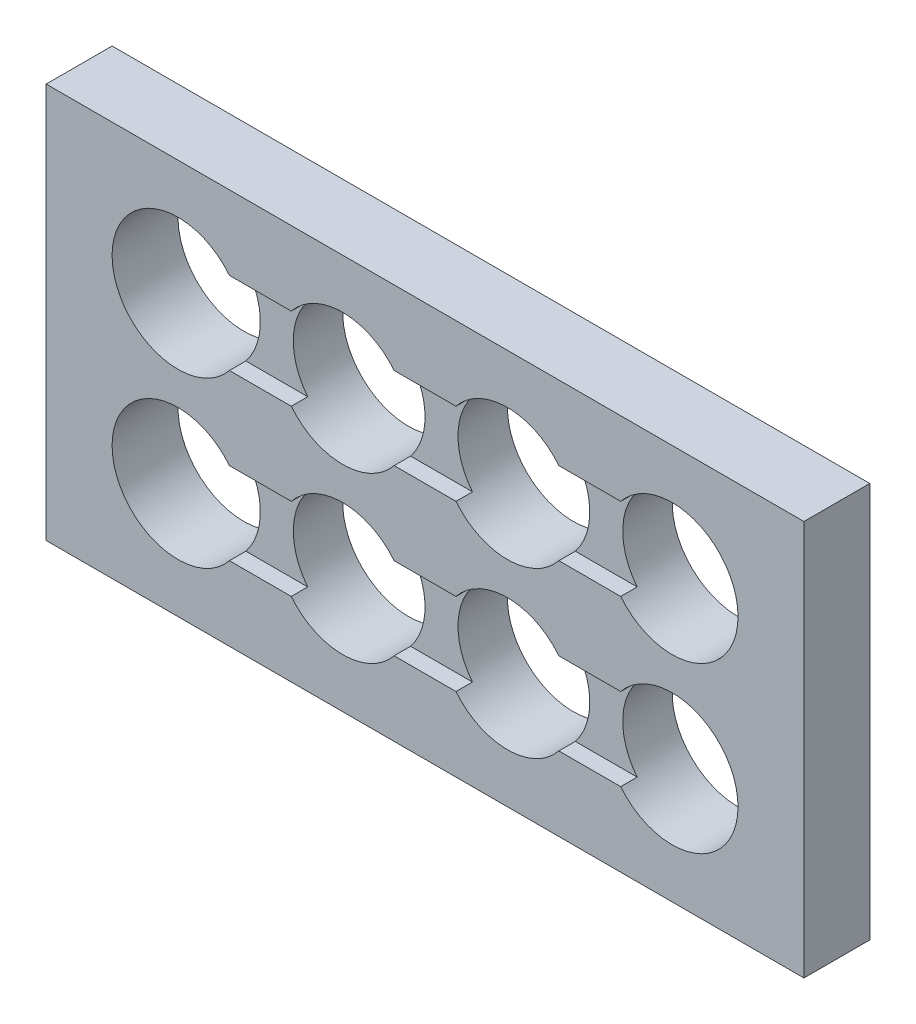
ISO-10303-21;
HEADER;
FILE_DESCRIPTION(('STEP AP214'),'2;1');
FILE_NAME('part.step','',(''),(''),'','','');
FILE_SCHEMA(('AUTOMOTIVE_DESIGN { 1 0 10303 214 1 1 1 1 }'));
ENDSEC;
DATA;
#1=APPLICATION_CONTEXT('core data for automotive mechanical design processes');
#2=APPLICATION_PROTOCOL_DEFINITION('international standard','automotive_design',2000,#1);
#3=PRODUCT_CONTEXT('',#1,'mechanical');
#4=PRODUCT('Part','Part','',(#3));
#5=PRODUCT_RELATED_PRODUCT_CATEGORY('part','',(#4));
#6=PRODUCT_DEFINITION_FORMATION('','',#4);
#7=PRODUCT_DEFINITION_CONTEXT('part definition',#1,'design');
#8=PRODUCT_DEFINITION('design','',#6,#7);
#9=PRODUCT_DEFINITION_SHAPE('','',#8);
#10=(LENGTH_UNIT() NAMED_UNIT(*) SI_UNIT(.MILLI.,.METRE.));
#11=(NAMED_UNIT(*) PLANE_ANGLE_UNIT() SI_UNIT($,.RADIAN.));
#12=(NAMED_UNIT(*) SI_UNIT($,.STERADIAN.) SOLID_ANGLE_UNIT());
#13=UNCERTAINTY_MEASURE_WITH_UNIT(LENGTH_MEASURE(1.E-05),#10,'distance_accuracy_value','');
#14=(GEOMETRIC_REPRESENTATION_CONTEXT(3) GLOBAL_UNCERTAINTY_ASSIGNED_CONTEXT((#13)) GLOBAL_UNIT_ASSIGNED_CONTEXT((#10,
#11,#12)) REPRESENTATION_CONTEXT('',''));
#15=CARTESIAN_POINT('',(0.,0.,0.));
#16=DIRECTION('',(0.,0.,1.));
#17=DIRECTION('',(1.,0.,0.));
#18=AXIS2_PLACEMENT_3D('',#15,#16,#17);
#19=CARTESIAN_POINT('',(0.,0.,4.));
#20=DIRECTION('',(0.,0.,1.));
#21=DIRECTION('',(1.,0.,0.));
#22=AXIS2_PLACEMENT_3D('',#19,#20,#21);
#23=PLANE('',#22);
#24=DIRECTION('',(1.,0.,0.));
#25=VECTOR('',#24,1.);
#26=CARTESIAN_POINT('',(15.,2.5,4.));
#27=LINE('',#26,#25);
#28=CARTESIAN_POINT('',(-11.8775010008008,2.5,4.));
#29=VERTEX_POINT('',#28);
#30=CARTESIAN_POINT('',(-8.1224989991992,2.5,4.));
#31=VERTEX_POINT('',#30);
#32=EDGE_CURVE('E232',#29,#31,#27,.T.);
#33=ORIENTED_EDGE('',*,*,#32,.F.);
#34=CARTESIAN_POINT('',(-15.,5.,4.));
#35=DIRECTION('',(0.,0.,1.));
#36=DIRECTION('',(1.,0.,0.));
#37=AXIS2_PLACEMENT_3D('',#34,#35,#36);
#38=CIRCLE('',#37,4.);
#39=CARTESIAN_POINT('',(-11.8775010008008,7.5,4.));
#40=VERTEX_POINT('',#39);
#41=EDGE_CURVE('E248',#40,#29,#38,.T.);
#42=ORIENTED_EDGE('',*,*,#41,.F.);
#43=DIRECTION('',(-1.,0.,0.));
#44=VECTOR('',#43,1.);
#45=CARTESIAN_POINT('',(15.,7.5,4.));
#46=LINE('',#45,#44);
#47=CARTESIAN_POINT('',(-8.1224989991992,7.5,4.));
#48=VERTEX_POINT('',#47);
#49=EDGE_CURVE('E253',#48,#40,#46,.T.);
#50=ORIENTED_EDGE('',*,*,#49,.F.);
#51=CARTESIAN_POINT('',(-5.,5.,4.));
#52=DIRECTION('',(0.,0.,1.));
#53=DIRECTION('',(1.,0.,0.));
#54=AXIS2_PLACEMENT_3D('',#51,#52,#53);
#55=CIRCLE('',#54,4.);
#56=CARTESIAN_POINT('',(-1.8775010008008,7.5,4.));
#57=VERTEX_POINT('',#56);
#58=EDGE_CURVE('E289',#57,#48,#55,.T.);
#59=ORIENTED_EDGE('',*,*,#58,.F.);
#60=CARTESIAN_POINT('',(1.8775010008008,7.5,4.));
#61=VERTEX_POINT('',#60);
#62=EDGE_CURVE('E431',#61,#57,#46,.T.);
#63=ORIENTED_EDGE('',*,*,#62,.F.);
#64=CARTESIAN_POINT('',(5.,5.,4.));
#65=DIRECTION('',(0.,0.,1.));
#66=DIRECTION('',(1.,0.,0.));
#67=AXIS2_PLACEMENT_3D('',#64,#65,#66);
#68=CIRCLE('',#67,4.);
#69=CARTESIAN_POINT('',(8.1224989991992,7.5,4.));
#70=VERTEX_POINT('',#69);
#71=EDGE_CURVE('E280',#70,#61,#68,.T.);
#72=ORIENTED_EDGE('',*,*,#71,.F.);
#73=CARTESIAN_POINT('',(11.8775010008008,7.5,4.));
#74=VERTEX_POINT('',#73);
#75=EDGE_CURVE('E432',#74,#70,#46,.T.);
#76=ORIENTED_EDGE('',*,*,#75,.F.);
#77=CARTESIAN_POINT('',(15.,5.,4.));
#78=DIRECTION('',(0.,0.,1.));
#79=DIRECTION('',(1.,0.,0.));
#80=AXIS2_PLACEMENT_3D('',#77,#78,#79);
#81=CIRCLE('',#80,4.);
#82=CARTESIAN_POINT('',(11.8775010008008,2.5,4.));
#83=VERTEX_POINT('',#82);
#84=EDGE_CURVE('E268',#83,#74,#81,.T.);
#85=ORIENTED_EDGE('',*,*,#84,.F.);
#86=CARTESIAN_POINT('',(8.1224989991992,2.5,4.));
#87=VERTEX_POINT('',#86);
#88=EDGE_CURVE('E256',#87,#83,#27,.T.);
#89=ORIENTED_EDGE('',*,*,#88,.F.);
#90=CARTESIAN_POINT('',(1.8775010008008,2.5,4.));
#91=VERTEX_POINT('',#90);
#92=EDGE_CURVE('E285',#91,#87,#68,.T.);
#93=ORIENTED_EDGE('',*,*,#92,.F.);
#94=CARTESIAN_POINT('',(-1.8775010008008,2.5,4.));
#95=VERTEX_POINT('',#94);
#96=EDGE_CURVE('E254',#95,#91,#27,.T.);
#97=ORIENTED_EDGE('',*,*,#96,.F.);
#98=EDGE_CURVE('E251',#31,#95,#55,.T.);
#99=ORIENTED_EDGE('',*,*,#98,.F.);
#100=EDGE_LOOP('',(#33,#42,#50,#59,#63,#72,#76,#85,#89,#93,#97,#99));
#101=FACE_BOUND('',#100,.T.);
#102=DIRECTION('',(-1.,0.,0.));
#103=VECTOR('',#102,1.);
#104=CARTESIAN_POINT('',(15.,-2.5,4.));
#105=LINE('',#104,#103);
#106=CARTESIAN_POINT('',(11.8775010008008,-2.5,4.));
#107=VERTEX_POINT('',#106);
#108=CARTESIAN_POINT('',(8.1224989991992,-2.5,4.));
#109=VERTEX_POINT('',#108);
#110=EDGE_CURVE('E428',#107,#109,#105,.T.);
#111=ORIENTED_EDGE('',*,*,#110,.F.);
#112=CARTESIAN_POINT('',(15.,-5.,4.));
#113=DIRECTION('',(0.,0.,1.));
#114=DIRECTION('',(1.,0.,0.));
#115=AXIS2_PLACEMENT_3D('',#112,#113,#114);
#116=CIRCLE('',#115,4.);
#117=CARTESIAN_POINT('',(11.8775010008008,-7.5,4.));
#118=VERTEX_POINT('',#117);
#119=EDGE_CURVE('E297',#118,#107,#116,.T.);
#120=ORIENTED_EDGE('',*,*,#119,.F.);
#121=DIRECTION('',(1.,0.,0.));
#122=VECTOR('',#121,1.);
#123=CARTESIAN_POINT('',(15.,-7.5,4.));
#124=LINE('',#123,#122);
#125=CARTESIAN_POINT('',(8.1224989991992,-7.5,4.));
#126=VERTEX_POINT('',#125);
#127=EDGE_CURVE('E388',#126,#118,#124,.T.);
#128=ORIENTED_EDGE('',*,*,#127,.F.);
#129=CARTESIAN_POINT('',(5.,-5.,4.));
#130=DIRECTION('',(0.,0.,1.));
#131=DIRECTION('',(1.,0.,0.));
#132=AXIS2_PLACEMENT_3D('',#129,#130,#131);
#133=CIRCLE('',#132,4.);
#134=CARTESIAN_POINT('',(1.8775010008008,-7.5,4.));
#135=VERTEX_POINT('',#134);
#136=EDGE_CURVE('E310',#135,#126,#133,.T.);
#137=ORIENTED_EDGE('',*,*,#136,.F.);
#138=CARTESIAN_POINT('',(-1.8775010008008,-7.5,4.));
#139=VERTEX_POINT('',#138);
#140=EDGE_CURVE('E411',#139,#135,#124,.T.);
#141=ORIENTED_EDGE('',*,*,#140,.F.);
#142=CARTESIAN_POINT('',(-5.,-5.,4.));
#143=DIRECTION('',(0.,0.,1.));
#144=DIRECTION('',(1.,0.,0.));
#145=AXIS2_PLACEMENT_3D('',#142,#143,#144);
#146=CIRCLE('',#145,4.);
#147=CARTESIAN_POINT('',(-8.12249899919919,-7.5,4.));
#148=VERTEX_POINT('',#147);
#149=EDGE_CURVE('E319',#148,#139,#146,.T.);
#150=ORIENTED_EDGE('',*,*,#149,.F.);
#151=CARTESIAN_POINT('',(-11.8775010008008,-7.5,4.));
#152=VERTEX_POINT('',#151);
#153=EDGE_CURVE('E413',#152,#148,#124,.T.);
#154=ORIENTED_EDGE('',*,*,#153,.F.);
#155=CARTESIAN_POINT('',(-15.,-5.,4.));
#156=DIRECTION('',(0.,0.,1.));
#157=DIRECTION('',(1.,0.,0.));
#158=AXIS2_PLACEMENT_3D('',#155,#156,#157);
#159=CIRCLE('',#158,4.);
#160=CARTESIAN_POINT('',(-11.8775010008008,-2.5,4.));
#161=VERTEX_POINT('',#160);
#162=EDGE_CURVE('E323',#161,#152,#159,.T.);
#163=ORIENTED_EDGE('',*,*,#162,.F.);
#164=CARTESIAN_POINT('',(-8.1224989991992,-2.5,4.));
#165=VERTEX_POINT('',#164);
#166=EDGE_CURVE('E425',#165,#161,#105,.T.);
#167=ORIENTED_EDGE('',*,*,#166,.F.);
#168=CARTESIAN_POINT('',(-1.8775010008008,-2.5,4.));
#169=VERTEX_POINT('',#168);
#170=EDGE_CURVE('E314',#169,#165,#146,.T.);
#171=ORIENTED_EDGE('',*,*,#170,.F.);
#172=CARTESIAN_POINT('',(1.8775010008008,-2.5,4.));
#173=VERTEX_POINT('',#172);
#174=EDGE_CURVE('E427',#173,#169,#105,.T.);
#175=ORIENTED_EDGE('',*,*,#174,.F.);
#176=EDGE_CURVE('E305',#109,#173,#133,.T.);
#177=ORIENTED_EDGE('',*,*,#176,.F.);
#178=EDGE_LOOP('',(#111,#120,#128,#137,#141,#150,#154,#163,#167,#171,#175,#177));
#179=FACE_BOUND('',#178,.T.);
#180=DIRECTION('',(0.,-1.,0.));
#181=VECTOR('',#180,1.);
#182=CARTESIAN_POINT('',(-23.,12.,4.));
#183=LINE('',#182,#181);
#184=CARTESIAN_POINT('',(-23.,12.,4.));
#185=VERTEX_POINT('',#184);
#186=CARTESIAN_POINT('',(-23.,-12.,4.));
#187=VERTEX_POINT('',#186);
#188=EDGE_CURVE('E331',#185,#187,#183,.T.);
#189=ORIENTED_EDGE('',*,*,#188,.T.);
#190=DIRECTION('',(1.,0.,0.));
#191=VECTOR('',#190,1.);
#192=CARTESIAN_POINT('',(-23.,-12.,4.));
#193=LINE('',#192,#191);
#194=CARTESIAN_POINT('',(23.,-12.,4.));
#195=VERTEX_POINT('',#194);
#196=EDGE_CURVE('E335',#187,#195,#193,.T.);
#197=ORIENTED_EDGE('',*,*,#196,.T.);
#198=DIRECTION('',(0.,1.,0.));
#199=VECTOR('',#198,1.);
#200=CARTESIAN_POINT('',(23.,12.,4.));
#201=LINE('',#200,#199);
#202=CARTESIAN_POINT('',(23.,12.,4.));
#203=VERTEX_POINT('',#202);
#204=EDGE_CURVE('E339',#195,#203,#201,.T.);
#205=ORIENTED_EDGE('',*,*,#204,.T.);
#206=DIRECTION('',(-1.,0.,0.));
#207=VECTOR('',#206,1.);
#208=CARTESIAN_POINT('',(-23.,12.,4.));
#209=LINE('',#208,#207);
#210=EDGE_CURVE('E342',#203,#185,#209,.T.);
#211=ORIENTED_EDGE('',*,*,#210,.T.);
#212=EDGE_LOOP('',(#189,#197,#205,#211));
#213=FACE_BOUND('',#212,.T.);
#214=ADVANCED_FACE('F44',(#101,#179,#213),#23,.T.);
#215=CARTESIAN_POINT('',(0.,0.,0.));
#216=DIRECTION('',(0.,0.,1.));
#217=DIRECTION('',(1.,0.,0.));
#218=AXIS2_PLACEMENT_3D('',#215,#216,#217);
#219=PLANE('',#218);
#220=DIRECTION('',(0.,-1.,0.));
#221=VECTOR('',#220,1.);
#222=CARTESIAN_POINT('',(-23.,12.,0.));
#223=LINE('',#222,#221);
#224=CARTESIAN_POINT('',(-23.,12.,0.));
#225=VERTEX_POINT('',#224);
#226=CARTESIAN_POINT('',(-23.,-12.,0.));
#227=VERTEX_POINT('',#226);
#228=EDGE_CURVE('E327',#225,#227,#223,.T.);
#229=ORIENTED_EDGE('',*,*,#228,.F.);
#230=DIRECTION('',(-1.,0.,0.));
#231=VECTOR('',#230,1.);
#232=CARTESIAN_POINT('',(-23.,12.,0.));
#233=LINE('',#232,#231);
#234=CARTESIAN_POINT('',(23.,12.,0.));
#235=VERTEX_POINT('',#234);
#236=EDGE_CURVE('E336',#235,#225,#233,.T.);
#237=ORIENTED_EDGE('',*,*,#236,.F.);
#238=DIRECTION('',(0.,1.,0.));
#239=VECTOR('',#238,1.);
#240=CARTESIAN_POINT('',(23.,12.,0.));
#241=LINE('',#240,#239);
#242=CARTESIAN_POINT('',(23.,-12.,0.));
#243=VERTEX_POINT('',#242);
#244=EDGE_CURVE('E352',#243,#235,#241,.T.);
#245=ORIENTED_EDGE('',*,*,#244,.F.);
#246=DIRECTION('',(1.,0.,0.));
#247=VECTOR('',#246,1.);
#248=CARTESIAN_POINT('',(-23.,-12.,0.));
#249=LINE('',#248,#247);
#250=EDGE_CURVE('E349',#227,#243,#249,.T.);
#251=ORIENTED_EDGE('',*,*,#250,.F.);
#252=EDGE_LOOP('',(#229,#237,#245,#251));
#253=FACE_BOUND('',#252,.T.);
#254=CARTESIAN_POINT('',(-15.,-5.,0.));
#255=DIRECTION('',(0.,0.,1.));
#256=DIRECTION('',(1.,0.,0.));
#257=AXIS2_PLACEMENT_3D('',#254,#255,#256);
#258=CIRCLE('',#257,4.);
#259=CARTESIAN_POINT('',(-11.,-5.,0.));
#260=VERTEX_POINT('',#259);
#261=EDGE_CURVE('E318',#260,#260,#258,.T.);
#262=ORIENTED_EDGE('',*,*,#261,.T.);
#263=EDGE_LOOP('',(#262));
#264=FACE_BOUND('',#263,.T.);
#265=CARTESIAN_POINT('',(-5.,-5.,0.));
#266=DIRECTION('',(0.,0.,1.));
#267=DIRECTION('',(1.,0.,0.));
#268=AXIS2_PLACEMENT_3D('',#265,#266,#267);
#269=CIRCLE('',#268,4.);
#270=CARTESIAN_POINT('',(-0.999999999999997,-5.,0.));
#271=VERTEX_POINT('',#270);
#272=EDGE_CURVE('E309',#271,#271,#269,.T.);
#273=ORIENTED_EDGE('',*,*,#272,.T.);
#274=EDGE_LOOP('',(#273));
#275=FACE_BOUND('',#274,.T.);
#276=CARTESIAN_POINT('',(5.,-5.,0.));
#277=DIRECTION('',(0.,0.,1.));
#278=DIRECTION('',(1.,0.,0.));
#279=AXIS2_PLACEMENT_3D('',#276,#277,#278);
#280=CIRCLE('',#279,4.);
#281=CARTESIAN_POINT('',(9.,-5.,0.));
#282=VERTEX_POINT('',#281);
#283=EDGE_CURVE('E301',#282,#282,#280,.T.);
#284=ORIENTED_EDGE('',*,*,#283,.T.);
#285=EDGE_LOOP('',(#284));
#286=FACE_BOUND('',#285,.T.);
#287=CARTESIAN_POINT('',(15.,-5.,0.));
#288=DIRECTION('',(0.,0.,1.));
#289=DIRECTION('',(1.,0.,0.));
#290=AXIS2_PLACEMENT_3D('',#287,#288,#289);
#291=CIRCLE('',#290,4.);
#292=CARTESIAN_POINT('',(19.,-5.,0.));
#293=VERTEX_POINT('',#292);
#294=EDGE_CURVE('E293',#293,#293,#291,.T.);
#295=ORIENTED_EDGE('',*,*,#294,.T.);
#296=EDGE_LOOP('',(#295));
#297=FACE_BOUND('',#296,.T.);
#298=CARTESIAN_POINT('',(-5.,5.,0.));
#299=DIRECTION('',(0.,0.,1.));
#300=DIRECTION('',(1.,0.,0.));
#301=AXIS2_PLACEMENT_3D('',#298,#299,#300);
#302=CIRCLE('',#301,4.);
#303=CARTESIAN_POINT('',(-0.999999999999997,5.,0.));
#304=VERTEX_POINT('',#303);
#305=EDGE_CURVE('E284',#304,#304,#302,.T.);
#306=ORIENTED_EDGE('',*,*,#305,.T.);
#307=EDGE_LOOP('',(#306));
#308=FACE_BOUND('',#307,.T.);
#309=CARTESIAN_POINT('',(5.,5.,0.));
#310=DIRECTION('',(0.,0.,1.));
#311=DIRECTION('',(1.,0.,0.));
#312=AXIS2_PLACEMENT_3D('',#309,#310,#311);
#313=CIRCLE('',#312,4.);
#314=CARTESIAN_POINT('',(9.,5.,0.));
#315=VERTEX_POINT('',#314);
#316=EDGE_CURVE('E278',#315,#315,#313,.T.);
#317=ORIENTED_EDGE('',*,*,#316,.T.);
#318=EDGE_LOOP('',(#317));
#319=FACE_BOUND('',#318,.T.);
#320=CARTESIAN_POINT('',(15.,5.,0.));
#321=DIRECTION('',(0.,0.,1.));
#322=DIRECTION('',(1.,0.,0.));
#323=AXIS2_PLACEMENT_3D('',#320,#321,#322);
#324=CIRCLE('',#323,4.);
#325=CARTESIAN_POINT('',(19.,5.,0.));
#326=VERTEX_POINT('',#325);
#327=EDGE_CURVE('E262',#326,#326,#324,.T.);
#328=ORIENTED_EDGE('',*,*,#327,.T.);
#329=EDGE_LOOP('',(#328));
#330=FACE_BOUND('',#329,.T.);
#331=CARTESIAN_POINT('',(-15.,5.,0.));
#332=DIRECTION('',(0.,0.,1.));
#333=DIRECTION('',(1.,0.,0.));
#334=AXIS2_PLACEMENT_3D('',#331,#332,#333);
#335=CIRCLE('',#334,4.);
#336=CARTESIAN_POINT('',(-11.,5.,0.));
#337=VERTEX_POINT('',#336);
#338=EDGE_CURVE('E263',#337,#337,#335,.T.);
#339=ORIENTED_EDGE('',*,*,#338,.T.);
#340=EDGE_LOOP('',(#339));
#341=FACE_BOUND('',#340,.T.);
#342=ADVANCED_FACE('F644',(#253,#264,#275,#286,#297,#308,#319,#330,#341),#219,.F.);
#343=CARTESIAN_POINT('',(-23.,12.,4.));
#344=DIRECTION('',(1.,0.,0.));
#345=DIRECTION('',(0.,0.,-1.));
#346=AXIS2_PLACEMENT_3D('',#343,#344,#345);
#347=PLANE('',#346);
#348=ORIENTED_EDGE('',*,*,#228,.T.);
#349=DIRECTION('',(0.,0.,-1.));
#350=VECTOR('',#349,1.);
#351=CARTESIAN_POINT('',(-23.,-12.,4.));
#352=LINE('',#351,#350);
#353=EDGE_CURVE('E368',#187,#227,#352,.T.);
#354=ORIENTED_EDGE('',*,*,#353,.F.);
#355=ORIENTED_EDGE('',*,*,#188,.F.);
#356=DIRECTION('',(0.,0.,-1.));
#357=VECTOR('',#356,1.);
#358=CARTESIAN_POINT('',(-23.,12.,4.));
#359=LINE('',#358,#357);
#360=EDGE_CURVE('E345',#185,#225,#359,.T.);
#361=ORIENTED_EDGE('',*,*,#360,.T.);
#362=EDGE_LOOP('',(#348,#354,#355,#361));
#363=FACE_BOUND('',#362,.T.);
#364=ADVANCED_FACE('F46',(#363),#347,.F.);
#365=CARTESIAN_POINT('',(-23.,-12.,4.));
#366=DIRECTION('',(0.,1.,0.));
#367=DIRECTION('',(0.,0.,1.));
#368=AXIS2_PLACEMENT_3D('',#365,#366,#367);
#369=PLANE('',#368);
#370=ORIENTED_EDGE('',*,*,#250,.T.);
#371=DIRECTION('',(0.,0.,-1.));
#372=VECTOR('',#371,1.);
#373=CARTESIAN_POINT('',(23.,-12.,4.));
#374=LINE('',#373,#372);
#375=EDGE_CURVE('E364',#195,#243,#374,.T.);
#376=ORIENTED_EDGE('',*,*,#375,.F.);
#377=ORIENTED_EDGE('',*,*,#196,.F.);
#378=ORIENTED_EDGE('',*,*,#353,.T.);
#379=EDGE_LOOP('',(#370,#376,#377,#378));
#380=FACE_BOUND('',#379,.T.);
#381=ADVANCED_FACE('F661',(#380),#369,.F.);
#382=CARTESIAN_POINT('',(23.,12.,4.));
#383=DIRECTION('',(-1.,0.,0.));
#384=DIRECTION('',(0.,0.,1.));
#385=AXIS2_PLACEMENT_3D('',#382,#383,#384);
#386=PLANE('',#385);
#387=ORIENTED_EDGE('',*,*,#244,.T.);
#388=DIRECTION('',(0.,0.,-1.));
#389=VECTOR('',#388,1.);
#390=CARTESIAN_POINT('',(23.,12.,4.));
#391=LINE('',#390,#389);
#392=EDGE_CURVE('E360',#203,#235,#391,.T.);
#393=ORIENTED_EDGE('',*,*,#392,.F.);
#394=ORIENTED_EDGE('',*,*,#204,.F.);
#395=ORIENTED_EDGE('',*,*,#375,.T.);
#396=EDGE_LOOP('',(#387,#393,#394,#395));
#397=FACE_BOUND('',#396,.T.);
#398=ADVANCED_FACE('F658',(#397),#386,.F.);
#399=CARTESIAN_POINT('',(-23.,12.,4.));
#400=DIRECTION('',(0.,-1.,0.));
#401=DIRECTION('',(0.,0.,-1.));
#402=AXIS2_PLACEMENT_3D('',#399,#400,#401);
#403=PLANE('',#402);
#404=ORIENTED_EDGE('',*,*,#236,.T.);
#405=ORIENTED_EDGE('',*,*,#360,.F.);
#406=ORIENTED_EDGE('',*,*,#210,.F.);
#407=ORIENTED_EDGE('',*,*,#392,.T.);
#408=EDGE_LOOP('',(#404,#405,#406,#407));
#409=FACE_BOUND('',#408,.T.);
#410=ADVANCED_FACE('F656',(#409),#403,.F.);
#411=CARTESIAN_POINT('',(-15.,-5.,4.));
#412=DIRECTION('',(0.,0.,-1.));
#413=DIRECTION('',(-1.,0.,0.));
#414=AXIS2_PLACEMENT_3D('',#411,#412,#413);
#415=CYLINDRICAL_SURFACE('',#414,4.);
#416=DIRECTION('',(0.,0.,-1.));
#417=VECTOR('',#416,1.);
#418=CARTESIAN_POINT('',(-11.8775010008008,-2.5,4.));
#419=LINE('',#418,#417);
#420=CARTESIAN_POINT('',(-11.8775010008008,-2.5,3.));
#421=VERTEX_POINT('',#420);
#422=EDGE_CURVE('E271',#161,#421,#419,.T.);
#423=ORIENTED_EDGE('',*,*,#422,.F.);
#424=ORIENTED_EDGE('',*,*,#162,.T.);
#425=DIRECTION('',(0.,0.,-1.));
#426=VECTOR('',#425,1.);
#427=CARTESIAN_POINT('',(-11.8775010008008,-7.5,4.));
#428=LINE('',#427,#426);
#429=CARTESIAN_POINT('',(-11.8775010008008,-7.5,3.));
#430=VERTEX_POINT('',#429);
#431=EDGE_CURVE('E523',#430,#152,#428,.F.);
#432=ORIENTED_EDGE('',*,*,#431,.F.);
#433=CARTESIAN_POINT('',(-15.,-5.,3.));
#434=DIRECTION('',(0.,0.,1.));
#435=DIRECTION('',(1.,0.,0.));
#436=AXIS2_PLACEMENT_3D('',#433,#434,#435);
#437=CIRCLE('',#436,4.);
#438=EDGE_CURVE('E508',#430,#421,#437,.T.);
#439=ORIENTED_EDGE('',*,*,#438,.T.);
#440=EDGE_LOOP('',(#423,#424,#432,#439));
#441=FACE_BOUND('',#440,.T.);
#442=ORIENTED_EDGE('',*,*,#261,.F.);
#443=EDGE_LOOP('',(#442));
#444=FACE_BOUND('',#443,.T.);
#445=ADVANCED_FACE('F546',(#441,#444),#415,.F.);
#446=CARTESIAN_POINT('',(-5.,-5.,4.));
#447=DIRECTION('',(0.,0.,-1.));
#448=DIRECTION('',(-1.,0.,0.));
#449=AXIS2_PLACEMENT_3D('',#446,#447,#448);
#450=CYLINDRICAL_SURFACE('',#449,4.);
#451=DIRECTION('',(0.,0.,-1.));
#452=VECTOR('',#451,1.);
#453=CARTESIAN_POINT('',(-8.1224989991992,-2.5,4.));
#454=LINE('',#453,#452);
#455=CARTESIAN_POINT('',(-8.1224989991992,-2.5,3.));
#456=VERTEX_POINT('',#455);
#457=EDGE_CURVE('E531',#456,#165,#454,.F.);
#458=ORIENTED_EDGE('',*,*,#457,.F.);
#459=CARTESIAN_POINT('',(-5.,-5.,3.));
#460=DIRECTION('',(0.,0.,1.));
#461=DIRECTION('',(1.,0.,0.));
#462=AXIS2_PLACEMENT_3D('',#459,#460,#461);
#463=CIRCLE('',#462,4.);
#464=CARTESIAN_POINT('',(-8.12249899919919,-7.5,3.));
#465=VERTEX_POINT('',#464);
#466=EDGE_CURVE('E507',#456,#465,#463,.T.);
#467=ORIENTED_EDGE('',*,*,#466,.T.);
#468=DIRECTION('',(0.,0.,-1.));
#469=VECTOR('',#468,1.);
#470=CARTESIAN_POINT('',(-8.12249899919919,-7.5,4.));
#471=LINE('',#470,#469);
#472=EDGE_CURVE('E520',#148,#465,#471,.T.);
#473=ORIENTED_EDGE('',*,*,#472,.F.);
#474=ORIENTED_EDGE('',*,*,#149,.T.);
#475=DIRECTION('',(0.,0.,-1.));
#476=VECTOR('',#475,1.);
#477=CARTESIAN_POINT('',(-1.8775010008008,-7.5,4.));
#478=LINE('',#477,#476);
#479=CARTESIAN_POINT('',(-1.8775010008008,-7.5,3.));
#480=VERTEX_POINT('',#479);
#481=EDGE_CURVE('E517',#480,#139,#478,.F.);
#482=ORIENTED_EDGE('',*,*,#481,.F.);
#483=CARTESIAN_POINT('',(-1.8775010008008,-2.5,3.));
#484=VERTEX_POINT('',#483);
#485=EDGE_CURVE('E503',#480,#484,#463,.T.);
#486=ORIENTED_EDGE('',*,*,#485,.T.);
#487=DIRECTION('',(0.,0.,-1.));
#488=VECTOR('',#487,1.);
#489=CARTESIAN_POINT('',(-1.8775010008008,-2.5,4.));
#490=LINE('',#489,#488);
#491=EDGE_CURVE('E533',#169,#484,#490,.T.);
#492=ORIENTED_EDGE('',*,*,#491,.F.);
#493=ORIENTED_EDGE('',*,*,#170,.T.);
#494=EDGE_LOOP('',(#458,#467,#473,#474,#482,#486,#492,#493));
#495=FACE_BOUND('',#494,.T.);
#496=ORIENTED_EDGE('',*,*,#272,.F.);
#497=EDGE_LOOP('',(#496));
#498=FACE_BOUND('',#497,.T.);
#499=ADVANCED_FACE('F624',(#495,#498),#450,.F.);
#500=CARTESIAN_POINT('',(5.,-5.,4.));
#501=DIRECTION('',(0.,0.,-1.));
#502=DIRECTION('',(-1.,0.,0.));
#503=AXIS2_PLACEMENT_3D('',#500,#501,#502);
#504=CYLINDRICAL_SURFACE('',#503,4.);
#505=DIRECTION('',(0.,0.,-1.));
#506=VECTOR('',#505,1.);
#507=CARTESIAN_POINT('',(1.8775010008008,-2.5,4.));
#508=LINE('',#507,#506);
#509=CARTESIAN_POINT('',(1.8775010008008,-2.5,3.));
#510=VERTEX_POINT('',#509);
#511=EDGE_CURVE('E526',#510,#173,#508,.F.);
#512=ORIENTED_EDGE('',*,*,#511,.F.);
#513=CARTESIAN_POINT('',(5.,-5.,3.));
#514=DIRECTION('',(0.,0.,1.));
#515=DIRECTION('',(1.,0.,0.));
#516=AXIS2_PLACEMENT_3D('',#513,#514,#515);
#517=CIRCLE('',#516,4.);
#518=CARTESIAN_POINT('',(1.8775010008008,-7.5,3.));
#519=VERTEX_POINT('',#518);
#520=EDGE_CURVE('E502',#510,#519,#517,.T.);
#521=ORIENTED_EDGE('',*,*,#520,.T.);
#522=DIRECTION('',(0.,0.,-1.));
#523=VECTOR('',#522,1.);
#524=CARTESIAN_POINT('',(1.8775010008008,-7.5,4.));
#525=LINE('',#524,#523);
#526=EDGE_CURVE('E514',#135,#519,#525,.T.);
#527=ORIENTED_EDGE('',*,*,#526,.F.);
#528=ORIENTED_EDGE('',*,*,#136,.T.);
#529=DIRECTION('',(0.,0.,-1.));
#530=VECTOR('',#529,1.);
#531=CARTESIAN_POINT('',(8.1224989991992,-7.5,4.));
#532=LINE('',#531,#530);
#533=CARTESIAN_POINT('',(8.1224989991992,-7.5,3.));
#534=VERTEX_POINT('',#533);
#535=EDGE_CURVE('E511',#534,#126,#532,.F.);
#536=ORIENTED_EDGE('',*,*,#535,.F.);
#537=CARTESIAN_POINT('',(8.1224989991992,-2.5,3.));
#538=VERTEX_POINT('',#537);
#539=EDGE_CURVE('E499',#534,#538,#517,.T.);
#540=ORIENTED_EDGE('',*,*,#539,.T.);
#541=DIRECTION('',(0.,0.,-1.));
#542=VECTOR('',#541,1.);
#543=CARTESIAN_POINT('',(8.1224989991992,-2.5,4.));
#544=LINE('',#543,#542);
#545=EDGE_CURVE('E404',#109,#538,#544,.T.);
#546=ORIENTED_EDGE('',*,*,#545,.F.);
#547=ORIENTED_EDGE('',*,*,#176,.T.);
#548=EDGE_LOOP('',(#512,#521,#527,#528,#536,#540,#546,#547));
#549=FACE_BOUND('',#548,.T.);
#550=ORIENTED_EDGE('',*,*,#283,.F.);
#551=EDGE_LOOP('',(#550));
#552=FACE_BOUND('',#551,.T.);
#553=ADVANCED_FACE('F568',(#549,#552),#504,.F.);
#554=CARTESIAN_POINT('',(15.,-5.,4.));
#555=DIRECTION('',(0.,0.,-1.));
#556=DIRECTION('',(-1.,0.,0.));
#557=AXIS2_PLACEMENT_3D('',#554,#555,#556);
#558=CYLINDRICAL_SURFACE('',#557,4.);
#559=DIRECTION('',(0.,0.,-1.));
#560=VECTOR('',#559,1.);
#561=CARTESIAN_POINT('',(11.8775010008008,-2.5,4.));
#562=LINE('',#561,#560);
#563=CARTESIAN_POINT('',(11.8775010008008,-2.5,3.));
#564=VERTEX_POINT('',#563);
#565=EDGE_CURVE('E11',#564,#107,#562,.F.);
#566=ORIENTED_EDGE('',*,*,#565,.F.);
#567=CARTESIAN_POINT('',(15.,-5.,3.));
#568=DIRECTION('',(0.,0.,1.));
#569=DIRECTION('',(1.,0.,0.));
#570=AXIS2_PLACEMENT_3D('',#567,#568,#569);
#571=CIRCLE('',#570,4.);
#572=CARTESIAN_POINT('',(11.8775010008008,-7.5,3.));
#573=VERTEX_POINT('',#572);
#574=EDGE_CURVE('E240',#564,#573,#571,.T.);
#575=ORIENTED_EDGE('',*,*,#574,.T.);
#576=DIRECTION('',(0.,0.,-1.));
#577=VECTOR('',#576,1.);
#578=CARTESIAN_POINT('',(11.8775010008008,-7.5,4.));
#579=LINE('',#578,#577);
#580=EDGE_CURVE('E53',#118,#573,#579,.T.);
#581=ORIENTED_EDGE('',*,*,#580,.F.);
#582=ORIENTED_EDGE('',*,*,#119,.T.);
#583=EDGE_LOOP('',(#566,#575,#581,#582));
#584=FACE_BOUND('',#583,.T.);
#585=ORIENTED_EDGE('',*,*,#294,.F.);
#586=EDGE_LOOP('',(#585));
#587=FACE_BOUND('',#586,.T.);
#588=ADVANCED_FACE('F392',(#584,#587),#558,.F.);
#589=CARTESIAN_POINT('',(-5.,5.,4.));
#590=DIRECTION('',(0.,0.,-1.));
#591=DIRECTION('',(-1.,0.,0.));
#592=AXIS2_PLACEMENT_3D('',#589,#590,#591);
#593=CYLINDRICAL_SURFACE('',#592,4.);
#594=DIRECTION('',(0.,0.,-1.));
#595=VECTOR('',#594,1.);
#596=CARTESIAN_POINT('',(-1.8775010008008,2.5,4.));
#597=LINE('',#596,#595);
#598=CARTESIAN_POINT('',(-1.8775010008008,2.5,3.));
#599=VERTEX_POINT('',#598);
#600=EDGE_CURVE('E494',#599,#95,#597,.F.);
#601=ORIENTED_EDGE('',*,*,#600,.F.);
#602=CARTESIAN_POINT('',(-5.,5.,3.));
#603=DIRECTION('',(0.,0.,-1.));
#604=DIRECTION('',(-1.,0.,0.));
#605=AXIS2_PLACEMENT_3D('',#602,#603,#604);
#606=CIRCLE('',#605,4.);
#607=CARTESIAN_POINT('',(-1.8775010008008,7.5,3.));
#608=VERTEX_POINT('',#607);
#609=EDGE_CURVE('E462',#608,#599,#606,.T.);
#610=ORIENTED_EDGE('',*,*,#609,.F.);
#611=DIRECTION('',(0.,0.,-1.));
#612=VECTOR('',#611,1.);
#613=CARTESIAN_POINT('',(-1.8775010008008,7.5,4.));
#614=LINE('',#613,#612);
#615=EDGE_CURVE('E481',#57,#608,#614,.T.);
#616=ORIENTED_EDGE('',*,*,#615,.F.);
#617=ORIENTED_EDGE('',*,*,#58,.T.);
#618=DIRECTION('',(0.,0.,-1.));
#619=VECTOR('',#618,1.);
#620=CARTESIAN_POINT('',(-8.1224989991992,7.5,4.));
#621=LINE('',#620,#619);
#622=CARTESIAN_POINT('',(-8.1224989991992,7.5,3.));
#623=VERTEX_POINT('',#622);
#624=EDGE_CURVE('E460',#623,#48,#621,.F.);
#625=ORIENTED_EDGE('',*,*,#624,.F.);
#626=CARTESIAN_POINT('',(-8.1224989991992,2.5,3.));
#627=VERTEX_POINT('',#626);
#628=EDGE_CURVE('E452',#627,#623,#606,.T.);
#629=ORIENTED_EDGE('',*,*,#628,.F.);
#630=DIRECTION('',(0.,0.,-1.));
#631=VECTOR('',#630,1.);
#632=CARTESIAN_POINT('',(-8.1224989991992,2.5,4.));
#633=LINE('',#632,#631);
#634=EDGE_CURVE('E459',#31,#627,#633,.T.);
#635=ORIENTED_EDGE('',*,*,#634,.F.);
#636=ORIENTED_EDGE('',*,*,#98,.T.);
#637=EDGE_LOOP('',(#601,#610,#616,#617,#625,#629,#635,#636));
#638=FACE_BOUND('',#637,.T.);
#639=ORIENTED_EDGE('',*,*,#305,.F.);
#640=EDGE_LOOP('',(#639));
#641=FACE_BOUND('',#640,.T.);
#642=ADVANCED_FACE('F457',(#638,#641),#593,.F.);
#643=CARTESIAN_POINT('',(5.,5.,4.));
#644=DIRECTION('',(0.,0.,-1.));
#645=DIRECTION('',(-1.,0.,0.));
#646=AXIS2_PLACEMENT_3D('',#643,#644,#645);
#647=CYLINDRICAL_SURFACE('',#646,4.);
#648=DIRECTION('',(0.,0.,-1.));
#649=VECTOR('',#648,1.);
#650=CARTESIAN_POINT('',(8.1224989991992,2.5,4.));
#651=LINE('',#650,#649);
#652=CARTESIAN_POINT('',(8.1224989991992,2.5,3.));
#653=VERTEX_POINT('',#652);
#654=EDGE_CURVE('E487',#653,#87,#651,.F.);
#655=ORIENTED_EDGE('',*,*,#654,.F.);
#656=CARTESIAN_POINT('',(5.,5.,3.));
#657=DIRECTION('',(0.,0.,-1.));
#658=DIRECTION('',(-1.,0.,0.));
#659=AXIS2_PLACEMENT_3D('',#656,#657,#658);
#660=CIRCLE('',#659,4.);
#661=CARTESIAN_POINT('',(8.1224989991992,7.5,3.));
#662=VERTEX_POINT('',#661);
#663=EDGE_CURVE('E463',#662,#653,#660,.T.);
#664=ORIENTED_EDGE('',*,*,#663,.F.);
#665=DIRECTION('',(0.,0.,-1.));
#666=VECTOR('',#665,1.);
#667=CARTESIAN_POINT('',(8.1224989991992,7.5,4.));
#668=LINE('',#667,#666);
#669=EDGE_CURVE('E476',#70,#662,#668,.T.);
#670=ORIENTED_EDGE('',*,*,#669,.F.);
#671=ORIENTED_EDGE('',*,*,#71,.T.);
#672=DIRECTION('',(0.,0.,-1.));
#673=VECTOR('',#672,1.);
#674=CARTESIAN_POINT('',(1.8775010008008,7.5,4.));
#675=LINE('',#674,#673);
#676=CARTESIAN_POINT('',(1.8775010008008,7.5,3.));
#677=VERTEX_POINT('',#676);
#678=EDGE_CURVE('E473',#677,#61,#675,.F.);
#679=ORIENTED_EDGE('',*,*,#678,.F.);
#680=CARTESIAN_POINT('',(1.8775010008008,2.5,3.));
#681=VERTEX_POINT('',#680);
#682=EDGE_CURVE('E468',#681,#677,#660,.T.);
#683=ORIENTED_EDGE('',*,*,#682,.F.);
#684=DIRECTION('',(0.,0.,-1.));
#685=VECTOR('',#684,1.);
#686=CARTESIAN_POINT('',(1.8775010008008,2.5,4.));
#687=LINE('',#686,#685);
#688=EDGE_CURVE('E490',#91,#681,#687,.T.);
#689=ORIENTED_EDGE('',*,*,#688,.F.);
#690=ORIENTED_EDGE('',*,*,#92,.T.);
#691=EDGE_LOOP('',(#655,#664,#670,#671,#679,#683,#689,#690));
#692=FACE_BOUND('',#691,.T.);
#693=ORIENTED_EDGE('',*,*,#316,.F.);
#694=EDGE_LOOP('',(#693));
#695=FACE_BOUND('',#694,.T.);
#696=ADVANCED_FACE('F578',(#692,#695),#647,.F.);
#697=CARTESIAN_POINT('',(15.,5.,4.));
#698=DIRECTION('',(0.,0.,-1.));
#699=DIRECTION('',(-1.,0.,0.));
#700=AXIS2_PLACEMENT_3D('',#697,#698,#699);
#701=CYLINDRICAL_SURFACE('',#700,4.);
#702=DIRECTION('',(0.,0.,-1.));
#703=VECTOR('',#702,1.);
#704=CARTESIAN_POINT('',(11.8775010008008,2.5,4.));
#705=LINE('',#704,#703);
#706=CARTESIAN_POINT('',(11.8775010008008,2.5,3.));
#707=VERTEX_POINT('',#706);
#708=EDGE_CURVE('E484',#83,#707,#705,.T.);
#709=ORIENTED_EDGE('',*,*,#708,.F.);
#710=ORIENTED_EDGE('',*,*,#84,.T.);
#711=DIRECTION('',(0.,0.,-1.));
#712=VECTOR('',#711,1.);
#713=CARTESIAN_POINT('',(11.8775010008008,7.5,4.));
#714=LINE('',#713,#712);
#715=CARTESIAN_POINT('',(11.8775010008008,7.5,3.));
#716=VERTEX_POINT('',#715);
#717=EDGE_CURVE('E467',#716,#74,#714,.F.);
#718=ORIENTED_EDGE('',*,*,#717,.F.);
#719=CARTESIAN_POINT('',(15.,5.,3.));
#720=DIRECTION('',(0.,0.,-1.));
#721=DIRECTION('',(-1.,0.,0.));
#722=AXIS2_PLACEMENT_3D('',#719,#720,#721);
#723=CIRCLE('',#722,4.);
#724=EDGE_CURVE('E593',#707,#716,#723,.T.);
#725=ORIENTED_EDGE('',*,*,#724,.F.);
#726=EDGE_LOOP('',(#709,#710,#718,#725));
#727=FACE_BOUND('',#726,.T.);
#728=ORIENTED_EDGE('',*,*,#327,.F.);
#729=EDGE_LOOP('',(#728));
#730=FACE_BOUND('',#729,.T.);
#731=ADVANCED_FACE('F590',(#727,#730),#701,.F.);
#732=CARTESIAN_POINT('',(-15.,5.,4.));
#733=DIRECTION('',(0.,0.,-1.));
#734=DIRECTION('',(-1.,0.,0.));
#735=AXIS2_PLACEMENT_3D('',#732,#733,#734);
#736=CYLINDRICAL_SURFACE('',#735,4.);
#737=DIRECTION('',(0.,0.,-1.));
#738=VECTOR('',#737,1.);
#739=CARTESIAN_POINT('',(-11.8775010008008,2.5,4.));
#740=LINE('',#739,#738);
#741=CARTESIAN_POINT('',(-11.8775010008008,2.5,3.));
#742=VERTEX_POINT('',#741);
#743=EDGE_CURVE('E229',#742,#29,#740,.F.);
#744=ORIENTED_EDGE('',*,*,#743,.F.);
#745=CARTESIAN_POINT('',(-15.,5.,3.));
#746=DIRECTION('',(0.,0.,-1.));
#747=DIRECTION('',(-1.,0.,0.));
#748=AXIS2_PLACEMENT_3D('',#745,#746,#747);
#749=CIRCLE('',#748,4.);
#750=CARTESIAN_POINT('',(-11.8775010008008,7.5,3.));
#751=VERTEX_POINT('',#750);
#752=EDGE_CURVE('E372',#751,#742,#749,.T.);
#753=ORIENTED_EDGE('',*,*,#752,.F.);
#754=DIRECTION('',(0.,0.,-1.));
#755=VECTOR('',#754,1.);
#756=CARTESIAN_POINT('',(-11.8775010008008,7.5,4.));
#757=LINE('',#756,#755);
#758=EDGE_CURVE('E241',#40,#751,#757,.T.);
#759=ORIENTED_EDGE('',*,*,#758,.F.);
#760=ORIENTED_EDGE('',*,*,#41,.T.);
#761=EDGE_LOOP('',(#744,#753,#759,#760));
#762=FACE_BOUND('',#761,.T.);
#763=ORIENTED_EDGE('',*,*,#338,.F.);
#764=EDGE_LOOP('',(#763));
#765=FACE_BOUND('',#764,.T.);
#766=ADVANCED_FACE('F258',(#762,#765),#736,.F.);
#767=CARTESIAN_POINT('',(0.,0.,3.));
#768=DIRECTION('',(0.,0.,-1.));
#769=DIRECTION('',(-1.,0.,0.));
#770=AXIS2_PLACEMENT_3D('',#767,#768,#769);
#771=PLANE('',#770);
#772=ORIENTED_EDGE('',*,*,#628,.T.);
#773=DIRECTION('',(-1.,0.,0.));
#774=VECTOR('',#773,1.);
#775=CARTESIAN_POINT('',(15.,7.5,3.));
#776=LINE('',#775,#774);
#777=EDGE_CURVE('E435',#623,#751,#776,.T.);
#778=ORIENTED_EDGE('',*,*,#777,.T.);
#779=ORIENTED_EDGE('',*,*,#752,.T.);
#780=DIRECTION('',(1.,0.,0.));
#781=VECTOR('',#780,1.);
#782=CARTESIAN_POINT('',(15.,2.5,3.));
#783=LINE('',#782,#781);
#784=EDGE_CURVE('E235',#742,#627,#783,.T.);
#785=ORIENTED_EDGE('',*,*,#784,.T.);
#786=EDGE_LOOP('',(#772,#778,#779,#785));
#787=FACE_BOUND('',#786,.T.);
#788=ADVANCED_FACE('F451',(#787),#771,.F.);
#789=CARTESIAN_POINT('',(15.,7.5,3.));
#790=DIRECTION('',(0.,1.,0.));
#791=DIRECTION('',(0.,0.,1.));
#792=AXIS2_PLACEMENT_3D('',#789,#790,#791);
#793=PLANE('',#792);
#794=ORIENTED_EDGE('',*,*,#624,.T.);
#795=ORIENTED_EDGE('',*,*,#49,.T.);
#796=ORIENTED_EDGE('',*,*,#758,.T.);
#797=ORIENTED_EDGE('',*,*,#777,.F.);
#798=EDGE_LOOP('',(#794,#795,#796,#797));
#799=FACE_BOUND('',#798,.T.);
#800=ADVANCED_FACE('F700',(#799),#793,.F.);
#801=CARTESIAN_POINT('',(15.,2.5,3.));
#802=DIRECTION('',(0.,-1.,0.));
#803=DIRECTION('',(0.,0.,-1.));
#804=AXIS2_PLACEMENT_3D('',#801,#802,#803);
#805=PLANE('',#804);
#806=ORIENTED_EDGE('',*,*,#634,.T.);
#807=ORIENTED_EDGE('',*,*,#784,.F.);
#808=ORIENTED_EDGE('',*,*,#743,.T.);
#809=ORIENTED_EDGE('',*,*,#32,.T.);
#810=EDGE_LOOP('',(#806,#807,#808,#809));
#811=FACE_BOUND('',#810,.T.);
#812=ADVANCED_FACE('F231',(#811),#805,.F.);
#813=ORIENTED_EDGE('',*,*,#663,.T.);
#814=EDGE_CURVE('E440',#653,#707,#783,.T.);
#815=ORIENTED_EDGE('',*,*,#814,.T.);
#816=ORIENTED_EDGE('',*,*,#724,.T.);
#817=EDGE_CURVE('E439',#716,#662,#776,.T.);
#818=ORIENTED_EDGE('',*,*,#817,.T.);
#819=EDGE_LOOP('',(#813,#815,#816,#818));
#820=FACE_BOUND('',#819,.T.);
#821=ADVANCED_FACE('F702',(#820),#771,.F.);
#822=ORIENTED_EDGE('',*,*,#669,.T.);
#823=ORIENTED_EDGE('',*,*,#817,.F.);
#824=ORIENTED_EDGE('',*,*,#717,.T.);
#825=ORIENTED_EDGE('',*,*,#75,.T.);
#826=EDGE_LOOP('',(#822,#823,#824,#825));
#827=FACE_BOUND('',#826,.T.);
#828=ADVANCED_FACE('F778',(#827),#793,.F.);
#829=ORIENTED_EDGE('',*,*,#654,.T.);
#830=ORIENTED_EDGE('',*,*,#88,.T.);
#831=ORIENTED_EDGE('',*,*,#708,.T.);
#832=ORIENTED_EDGE('',*,*,#814,.F.);
#833=EDGE_LOOP('',(#829,#830,#831,#832));
#834=FACE_BOUND('',#833,.T.);
#835=ADVANCED_FACE('F587',(#834),#805,.F.);
#836=ORIENTED_EDGE('',*,*,#600,.T.);
#837=ORIENTED_EDGE('',*,*,#96,.T.);
#838=ORIENTED_EDGE('',*,*,#688,.T.);
#839=EDGE_CURVE('E442',#599,#681,#783,.T.);
#840=ORIENTED_EDGE('',*,*,#839,.F.);
#841=EDGE_LOOP('',(#836,#837,#838,#840));
#842=FACE_BOUND('',#841,.T.);
#843=ADVANCED_FACE('F611',(#842),#805,.F.);
#844=ORIENTED_EDGE('',*,*,#615,.T.);
#845=EDGE_CURVE('E438',#677,#608,#776,.T.);
#846=ORIENTED_EDGE('',*,*,#845,.F.);
#847=ORIENTED_EDGE('',*,*,#678,.T.);
#848=ORIENTED_EDGE('',*,*,#62,.T.);
#849=EDGE_LOOP('',(#844,#846,#847,#848));
#850=FACE_BOUND('',#849,.T.);
#851=ADVANCED_FACE('F615',(#850),#793,.F.);
#852=ORIENTED_EDGE('',*,*,#609,.T.);
#853=ORIENTED_EDGE('',*,*,#839,.T.);
#854=ORIENTED_EDGE('',*,*,#682,.T.);
#855=ORIENTED_EDGE('',*,*,#845,.T.);
#856=EDGE_LOOP('',(#852,#853,#854,#855));
#857=FACE_BOUND('',#856,.T.);
#858=ADVANCED_FACE('F604',(#857),#771,.F.);
#859=CARTESIAN_POINT('',(0.,0.,3.));
#860=DIRECTION('',(0.,0.,1.));
#861=DIRECTION('',(1.,0.,0.));
#862=AXIS2_PLACEMENT_3D('',#859,#860,#861);
#863=PLANE('',#862);
#864=DIRECTION('',(1.,0.,0.));
#865=VECTOR('',#864,1.);
#866=CARTESIAN_POINT('',(15.,-7.5,3.));
#867=LINE('',#866,#865);
#868=EDGE_CURVE('E385',#534,#573,#867,.T.);
#869=ORIENTED_EDGE('',*,*,#868,.T.);
#870=ORIENTED_EDGE('',*,*,#574,.F.);
#871=DIRECTION('',(-1.,0.,0.));
#872=VECTOR('',#871,1.);
#873=CARTESIAN_POINT('',(15.,-2.5,3.));
#874=LINE('',#873,#872);
#875=EDGE_CURVE('E398',#564,#538,#874,.T.);
#876=ORIENTED_EDGE('',*,*,#875,.T.);
#877=ORIENTED_EDGE('',*,*,#539,.F.);
#878=EDGE_LOOP('',(#869,#870,#876,#877));
#879=FACE_BOUND('',#878,.T.);
#880=ADVANCED_FACE('F397',(#879),#863,.T.);
#881=CARTESIAN_POINT('',(15.,-7.5,3.));
#882=DIRECTION('',(0.,-1.,0.));
#883=DIRECTION('',(0.,0.,-1.));
#884=AXIS2_PLACEMENT_3D('',#881,#882,#883);
#885=PLANE('',#884);
#886=ORIENTED_EDGE('',*,*,#535,.T.);
#887=ORIENTED_EDGE('',*,*,#127,.T.);
#888=ORIENTED_EDGE('',*,*,#580,.T.);
#889=ORIENTED_EDGE('',*,*,#868,.F.);
#890=EDGE_LOOP('',(#886,#887,#888,#889));
#891=FACE_BOUND('',#890,.T.);
#892=ADVANCED_FACE('F384',(#891),#885,.F.);
#893=CARTESIAN_POINT('',(15.,-2.5,3.));
#894=DIRECTION('',(0.,1.,0.));
#895=DIRECTION('',(0.,0.,1.));
#896=AXIS2_PLACEMENT_3D('',#893,#894,#895);
#897=PLANE('',#896);
#898=ORIENTED_EDGE('',*,*,#545,.T.);
#899=ORIENTED_EDGE('',*,*,#875,.F.);
#900=ORIENTED_EDGE('',*,*,#565,.T.);
#901=ORIENTED_EDGE('',*,*,#110,.T.);
#902=EDGE_LOOP('',(#898,#899,#900,#901));
#903=FACE_BOUND('',#902,.T.);
#904=ADVANCED_FACE('F401',(#903),#897,.F.);
#905=EDGE_CURVE('E68',#480,#519,#867,.T.);
#906=ORIENTED_EDGE('',*,*,#905,.T.);
#907=ORIENTED_EDGE('',*,*,#520,.F.);
#908=EDGE_CURVE('E406',#510,#484,#874,.T.);
#909=ORIENTED_EDGE('',*,*,#908,.T.);
#910=ORIENTED_EDGE('',*,*,#485,.F.);
#911=EDGE_LOOP('',(#906,#907,#909,#910));
#912=FACE_BOUND('',#911,.T.);
#913=ADVANCED_FACE('F626',(#912),#863,.T.);
#914=ORIENTED_EDGE('',*,*,#481,.T.);
#915=ORIENTED_EDGE('',*,*,#140,.T.);
#916=ORIENTED_EDGE('',*,*,#526,.T.);
#917=ORIENTED_EDGE('',*,*,#905,.F.);
#918=EDGE_LOOP('',(#914,#915,#916,#917));
#919=FACE_BOUND('',#918,.T.);
#920=ADVANCED_FACE('F561',(#919),#885,.F.);
#921=ORIENTED_EDGE('',*,*,#491,.T.);
#922=ORIENTED_EDGE('',*,*,#908,.F.);
#923=ORIENTED_EDGE('',*,*,#511,.T.);
#924=ORIENTED_EDGE('',*,*,#174,.T.);
#925=EDGE_LOOP('',(#921,#922,#923,#924));
#926=FACE_BOUND('',#925,.T.);
#927=ADVANCED_FACE('F621',(#926),#897,.F.);
#928=ORIENTED_EDGE('',*,*,#431,.T.);
#929=ORIENTED_EDGE('',*,*,#153,.T.);
#930=ORIENTED_EDGE('',*,*,#472,.T.);
#931=EDGE_CURVE('E60',#430,#465,#867,.T.);
#932=ORIENTED_EDGE('',*,*,#931,.F.);
#933=EDGE_LOOP('',(#928,#929,#930,#932));
#934=FACE_BOUND('',#933,.T.);
#935=ADVANCED_FACE('F632',(#934),#885,.F.);
#936=ORIENTED_EDGE('',*,*,#931,.T.);
#937=ORIENTED_EDGE('',*,*,#466,.F.);
#938=EDGE_CURVE('E408',#456,#421,#874,.T.);
#939=ORIENTED_EDGE('',*,*,#938,.T.);
#940=ORIENTED_EDGE('',*,*,#438,.F.);
#941=EDGE_LOOP('',(#936,#937,#939,#940));
#942=FACE_BOUND('',#941,.T.);
#943=ADVANCED_FACE('F630',(#942),#863,.T.);
#944=ORIENTED_EDGE('',*,*,#422,.T.);
#945=ORIENTED_EDGE('',*,*,#938,.F.);
#946=ORIENTED_EDGE('',*,*,#457,.T.);
#947=ORIENTED_EDGE('',*,*,#166,.T.);
#948=EDGE_LOOP('',(#944,#945,#946,#947));
#949=FACE_BOUND('',#948,.T.);
#950=ADVANCED_FACE('F541',(#949),#897,.F.);
#951=CLOSED_SHELL('',(#214,#342,#364,#381,#398,#410,#445,#499,#553,#588,#642,#696,#731,#766,
#788,#800,#812,#821,#828,#835,#843,#851,#858,#880,#892,#904,#913,#920,#927,#935,#943,#950));
#952=MANIFOLD_SOLID_BREP('B2',#951);
#953=ADVANCED_BREP_SHAPE_REPRESENTATION('',(#18,#952),#14);
#954=SHAPE_DEFINITION_REPRESENTATION(#9,#953);
ENDSEC;
END-ISO-10303-21;
